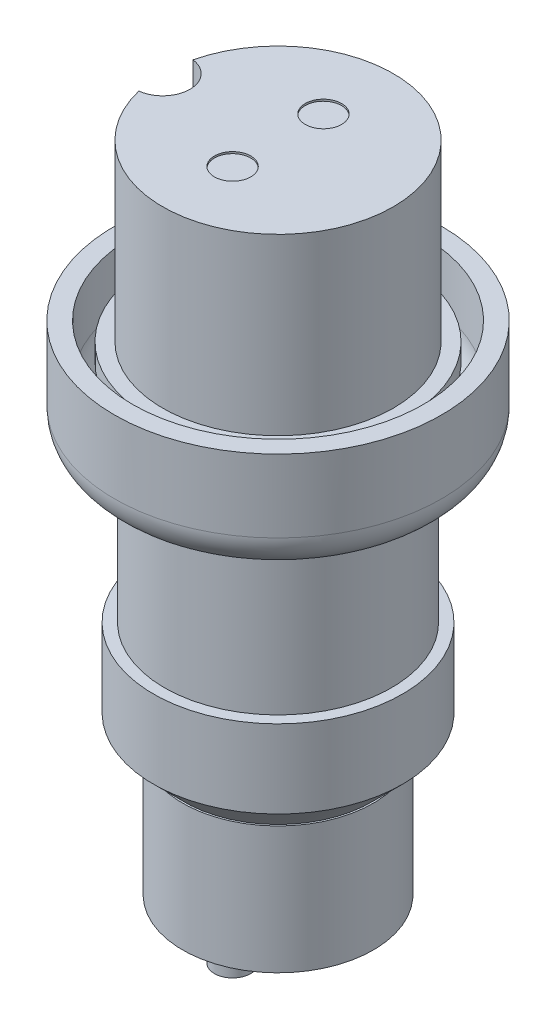
ISO-10303-21;
HEADER;
FILE_DESCRIPTION(('STEP AP214'),'2;1');
FILE_NAME('part.step','',(''),(''),'','','');
FILE_SCHEMA(('AUTOMOTIVE_DESIGN { 1 0 10303 214 1 1 1 1 }'));
ENDSEC;
DATA;
#1=APPLICATION_CONTEXT('core data for automotive mechanical design processes');
#2=APPLICATION_PROTOCOL_DEFINITION('international standard','automotive_design',2000,#1);
#3=PRODUCT_CONTEXT('',#1,'mechanical');
#4=PRODUCT('Part','Part','',(#3));
#5=PRODUCT_RELATED_PRODUCT_CATEGORY('part','',(#4));
#6=PRODUCT_DEFINITION_FORMATION('','',#4);
#7=PRODUCT_DEFINITION_CONTEXT('part definition',#1,'design');
#8=PRODUCT_DEFINITION('design','',#6,#7);
#9=PRODUCT_DEFINITION_SHAPE('','',#8);
#10=(LENGTH_UNIT() NAMED_UNIT(*) SI_UNIT(.MILLI.,.METRE.));
#11=(NAMED_UNIT(*) PLANE_ANGLE_UNIT() SI_UNIT($,.RADIAN.));
#12=(NAMED_UNIT(*) SI_UNIT($,.STERADIAN.) SOLID_ANGLE_UNIT());
#13=UNCERTAINTY_MEASURE_WITH_UNIT(LENGTH_MEASURE(1.E-05),#10,'distance_accuracy_value','');
#14=(GEOMETRIC_REPRESENTATION_CONTEXT(3) GLOBAL_UNCERTAINTY_ASSIGNED_CONTEXT((#13)) GLOBAL_UNIT_ASSIGNED_CONTEXT((#10,
#11,#12)) REPRESENTATION_CONTEXT('',''));
#15=CARTESIAN_POINT('',(0.,0.,0.));
#16=DIRECTION('',(0.,0.,1.));
#17=DIRECTION('',(1.,0.,0.));
#18=AXIS2_PLACEMENT_3D('',#15,#16,#17);
#19=CARTESIAN_POINT('',(0.,-13.38,0.));
#20=DIRECTION('',(0.,1.,0.));
#21=DIRECTION('',(0.,0.,1.));
#22=AXIS2_PLACEMENT_3D('',#19,#20,#21);
#23=CYLINDRICAL_SURFACE('',#22,6.25);
#24=CARTESIAN_POINT('',(0.,-5.,0.));
#25=DIRECTION('',(0.,-1.,0.));
#26=DIRECTION('',(0.,0.,-1.));
#27=AXIS2_PLACEMENT_3D('',#24,#25,#26);
#28=CIRCLE('',#27,6.25);
#29=CARTESIAN_POINT('',(0.,-5.,-6.25));
#30=VERTEX_POINT('',#29);
#31=EDGE_CURVE('E92',#30,#30,#28,.T.);
#32=ORIENTED_EDGE('',*,*,#31,.T.);
#33=EDGE_LOOP('',(#32));
#34=FACE_BOUND('',#33,.T.);
#35=CARTESIAN_POINT('',(0.,-13.38,0.));
#36=DIRECTION('',(0.,-1.,0.));
#37=DIRECTION('',(0.,0.,-1.));
#38=AXIS2_PLACEMENT_3D('',#35,#36,#37);
#39=CIRCLE('',#38,6.25);
#40=CARTESIAN_POINT('',(0.,-13.38,-6.25));
#41=VERTEX_POINT('',#40);
#42=EDGE_CURVE('E147',#41,#41,#39,.T.);
#43=ORIENTED_EDGE('',*,*,#42,.F.);
#44=EDGE_LOOP('',(#43));
#45=FACE_BOUND('',#44,.T.);
#46=ADVANCED_FACE('F36',(#34,#45),#23,.T.);
#47=CARTESIAN_POINT('',(0.,-19.38,0.));
#48=DIRECTION('',(0.,1.,0.));
#49=DIRECTION('',(0.,0.,1.));
#50=AXIS2_PLACEMENT_3D('',#47,#48,#49);
#51=CYLINDRICAL_SURFACE('',#50,6.85);
#52=CARTESIAN_POINT('',(0.,-17.68,0.));
#53=DIRECTION('',(0.,-1.,0.));
#54=DIRECTION('',(0.,0.,-1.));
#55=AXIS2_PLACEMENT_3D('',#52,#53,#54);
#56=CIRCLE('',#55,6.85);
#57=CARTESIAN_POINT('',(0.,-17.68,-6.85));
#58=VERTEX_POINT('',#57);
#59=EDGE_CURVE('E88',#58,#58,#56,.F.);
#60=ORIENTED_EDGE('',*,*,#59,.T.);
#61=EDGE_LOOP('',(#60));
#62=FACE_BOUND('',#61,.T.);
#63=CARTESIAN_POINT('',(0.,-13.38,0.));
#64=DIRECTION('',(0.,-1.,0.));
#65=DIRECTION('',(0.,0.,-1.));
#66=AXIS2_PLACEMENT_3D('',#63,#64,#65);
#67=CIRCLE('',#66,6.85);
#68=CARTESIAN_POINT('',(0.,-13.38,-6.85));
#69=VERTEX_POINT('',#68);
#70=EDGE_CURVE('E148',#69,#69,#67,.T.);
#71=ORIENTED_EDGE('',*,*,#70,.T.);
#72=EDGE_LOOP('',(#71));
#73=FACE_BOUND('',#72,.T.);
#74=ADVANCED_FACE('F122',(#62,#73),#51,.T.);
#75=CARTESIAN_POINT('',(0.,-13.38,0.));
#76=DIRECTION('',(0.,-1.,0.));
#77=DIRECTION('',(0.,0.,-1.));
#78=AXIS2_PLACEMENT_3D('',#75,#76,#77);
#79=PLANE('',#78);
#80=ORIENTED_EDGE('',*,*,#42,.T.);
#81=EDGE_LOOP('',(#80));
#82=FACE_BOUND('',#81,.T.);
#83=ORIENTED_EDGE('',*,*,#70,.F.);
#84=EDGE_LOOP('',(#83));
#85=FACE_BOUND('',#84,.T.);
#86=ADVANCED_FACE('F128',(#82,#85),#79,.F.);
#87=CARTESIAN_POINT('',(0.,-19.38,0.));
#88=DIRECTION('',(0.,1.,0.));
#89=DIRECTION('',(0.,0.,1.));
#90=AXIS2_PLACEMENT_3D('',#87,#88,#89);
#91=CONICAL_SURFACE('',#90,5.14999999999999,0.785398163397446);
#92=ORIENTED_EDGE('',*,*,#59,.F.);
#93=EDGE_LOOP('',(#92));
#94=FACE_BOUND('',#93,.T.);
#95=CARTESIAN_POINT('',(0.,-19.38,0.));
#96=DIRECTION('',(0.,-1.,0.));
#97=DIRECTION('',(0.,0.,-1.));
#98=AXIS2_PLACEMENT_3D('',#95,#96,#97);
#99=CIRCLE('',#98,5.14999999999999);
#100=CARTESIAN_POINT('',(0.,-19.38,-5.14999999999999));
#101=VERTEX_POINT('',#100);
#102=EDGE_CURVE('E79',#101,#101,#99,.T.);
#103=ORIENTED_EDGE('',*,*,#102,.F.);
#104=EDGE_LOOP('',(#103));
#105=FACE_BOUND('',#104,.T.);
#106=ADVANCED_FACE('F256',(#94,#105),#91,.T.);
#107=CARTESIAN_POINT('',(0.,-26.38,0.));
#108=DIRECTION('',(0.,1.,0.));
#109=DIRECTION('',(0.,0.,1.));
#110=AXIS2_PLACEMENT_3D('',#107,#108,#109);
#111=CYLINDRICAL_SURFACE('',#110,5.25);
#112=CARTESIAN_POINT('',(0.,-26.38,0.));
#113=DIRECTION('',(0.,-1.,0.));
#114=DIRECTION('',(0.,0.,-1.));
#115=AXIS2_PLACEMENT_3D('',#112,#113,#114);
#116=CIRCLE('',#115,5.25);
#117=CARTESIAN_POINT('',(0.,-26.38,-5.25));
#118=VERTEX_POINT('',#117);
#119=EDGE_CURVE('E153',#118,#118,#116,.T.);
#120=ORIENTED_EDGE('',*,*,#119,.F.);
#121=EDGE_LOOP('',(#120));
#122=FACE_BOUND('',#121,.T.);
#123=CARTESIAN_POINT('',(0.,-19.38,0.));
#124=DIRECTION('',(0.,-1.,0.));
#125=DIRECTION('',(0.,0.,-1.));
#126=AXIS2_PLACEMENT_3D('',#123,#124,#125);
#127=CIRCLE('',#126,5.25);
#128=CARTESIAN_POINT('',(0.,-19.38,-5.25));
#129=VERTEX_POINT('',#128);
#130=EDGE_CURVE('E95',#129,#129,#127,.T.);
#131=ORIENTED_EDGE('',*,*,#130,.T.);
#132=EDGE_LOOP('',(#131));
#133=FACE_BOUND('',#132,.T.);
#134=ADVANCED_FACE('F249',(#122,#133),#111,.T.);
#135=CARTESIAN_POINT('',(0.,-26.38,0.));
#136=DIRECTION('',(0.,-1.,0.));
#137=DIRECTION('',(0.,0.,-1.));
#138=AXIS2_PLACEMENT_3D('',#135,#136,#137);
#139=PLANE('',#138);
#140=CARTESIAN_POINT('',(0.,-26.38,2.5));
#141=DIRECTION('',(0.,-1.,0.));
#142=DIRECTION('',(0.,0.,-1.));
#143=AXIS2_PLACEMENT_3D('',#140,#141,#142);
#144=CIRCLE('',#143,1.);
#145=CARTESIAN_POINT('',(0.,-26.38,1.5));
#146=VERTEX_POINT('',#145);
#147=EDGE_CURVE('E67',#146,#146,#144,.T.);
#148=ORIENTED_EDGE('',*,*,#147,.F.);
#149=EDGE_LOOP('',(#148));
#150=FACE_BOUND('',#149,.T.);
#151=CARTESIAN_POINT('',(0.,-26.38,-2.5));
#152=DIRECTION('',(0.,-1.,0.));
#153=DIRECTION('',(0.,0.,-1.));
#154=AXIS2_PLACEMENT_3D('',#151,#152,#153);
#155=CIRCLE('',#154,1.);
#156=CARTESIAN_POINT('',(0.,-26.38,-3.5));
#157=VERTEX_POINT('',#156);
#158=EDGE_CURVE('E166',#157,#157,#155,.T.);
#159=ORIENTED_EDGE('',*,*,#158,.F.);
#160=EDGE_LOOP('',(#159));
#161=FACE_BOUND('',#160,.T.);
#162=ORIENTED_EDGE('',*,*,#119,.T.);
#163=EDGE_LOOP('',(#162));
#164=FACE_BOUND('',#163,.T.);
#165=ADVANCED_FACE('F246',(#150,#161,#164),#139,.T.);
#166=CARTESIAN_POINT('',(0.,-19.38,0.));
#167=DIRECTION('',(0.,-1.,0.));
#168=DIRECTION('',(0.,0.,-1.));
#169=AXIS2_PLACEMENT_3D('',#166,#167,#168);
#170=PLANE('',#169);
#171=ORIENTED_EDGE('',*,*,#102,.T.);
#172=EDGE_LOOP('',(#171));
#173=FACE_BOUND('',#172,.T.);
#174=ORIENTED_EDGE('',*,*,#130,.F.);
#175=EDGE_LOOP('',(#174));
#176=FACE_BOUND('',#175,.T.);
#177=ADVANCED_FACE('F244',(#173,#176),#170,.F.);
#178=CARTESIAN_POINT('',(0.,-4.,0.));
#179=DIRECTION('',(0.,-1.,0.));
#180=DIRECTION('',(0.,0.,-1.));
#181=AXIS2_PLACEMENT_3D('',#178,#179,#180);
#182=CYLINDRICAL_SURFACE('',#181,9.);
#183=CARTESIAN_POINT('',(0.,-3.,0.));
#184=DIRECTION('',(0.,-1.,0.));
#185=DIRECTION('',(0.,0.,-1.));
#186=AXIS2_PLACEMENT_3D('',#183,#184,#185);
#187=CIRCLE('',#186,9.);
#188=CARTESIAN_POINT('',(0.,-3.,-9.));
#189=VERTEX_POINT('',#188);
#190=EDGE_CURVE('E11',#189,#189,#187,.F.);
#191=ORIENTED_EDGE('',*,*,#190,.T.);
#192=EDGE_LOOP('',(#191));
#193=FACE_BOUND('',#192,.T.);
#194=CARTESIAN_POINT('',(0.,1.,0.));
#195=DIRECTION('',(0.,1.,0.));
#196=DIRECTION('',(0.,0.,1.));
#197=AXIS2_PLACEMENT_3D('',#194,#195,#196);
#198=CIRCLE('',#197,9.);
#199=CARTESIAN_POINT('',(0.,1.,9.));
#200=VERTEX_POINT('',#199);
#201=EDGE_CURVE('E96',#200,#200,#198,.T.);
#202=ORIENTED_EDGE('',*,*,#201,.F.);
#203=EDGE_LOOP('',(#202));
#204=FACE_BOUND('',#203,.T.);
#205=ADVANCED_FACE('F241',(#193,#204),#182,.T.);
#206=CARTESIAN_POINT('',(0.,-5.,0.));
#207=DIRECTION('',(0.,-1.,0.));
#208=DIRECTION('',(0.,0.,-1.));
#209=AXIS2_PLACEMENT_3D('',#206,#207,#208);
#210=PLANE('',#209);
#211=CARTESIAN_POINT('',(0.,-5.,0.));
#212=DIRECTION('',(0.,-1.,0.));
#213=DIRECTION('',(0.,0.,-1.));
#214=AXIS2_PLACEMENT_3D('',#211,#212,#213);
#215=CIRCLE('',#214,7.);
#216=CARTESIAN_POINT('',(0.,-5.,-7.));
#217=VERTEX_POINT('',#216);
#218=EDGE_CURVE('E44',#217,#217,#215,.T.);
#219=ORIENTED_EDGE('',*,*,#218,.T.);
#220=EDGE_LOOP('',(#219));
#221=FACE_BOUND('',#220,.T.);
#222=ORIENTED_EDGE('',*,*,#31,.F.);
#223=EDGE_LOOP('',(#222));
#224=FACE_BOUND('',#223,.T.);
#225=ADVANCED_FACE('F104',(#221,#224),#210,.T.);
#226=CARTESIAN_POINT('',(0.,1.,0.));
#227=DIRECTION('',(0.,1.,0.));
#228=DIRECTION('',(0.,0.,1.));
#229=AXIS2_PLACEMENT_3D('',#226,#227,#228);
#230=PLANE('',#229);
#231=ORIENTED_EDGE('',*,*,#201,.T.);
#232=EDGE_LOOP('',(#231));
#233=FACE_BOUND('',#232,.T.);
#234=CARTESIAN_POINT('',(0.,1.,0.));
#235=DIRECTION('',(0.,1.,0.));
#236=DIRECTION('',(0.,0.,1.));
#237=AXIS2_PLACEMENT_3D('',#234,#235,#236);
#238=CIRCLE('',#237,8.);
#239=CARTESIAN_POINT('',(0.,1.,8.));
#240=VERTEX_POINT('',#239);
#241=EDGE_CURVE('E162',#240,#240,#238,.T.);
#242=ORIENTED_EDGE('',*,*,#241,.F.);
#243=EDGE_LOOP('',(#242));
#244=FACE_BOUND('',#243,.T.);
#245=ADVANCED_FACE('F234',(#233,#244),#230,.T.);
#246=CARTESIAN_POINT('',(0.,1.,0.));
#247=DIRECTION('',(0.,-1.,0.));
#248=DIRECTION('',(0.,0.,-1.));
#249=AXIS2_PLACEMENT_3D('',#246,#247,#248);
#250=CYLINDRICAL_SURFACE('',#249,8.);
#251=CARTESIAN_POINT('',(0.,-2.01568651670156,0.));
#252=DIRECTION('',(0.,-1.,0.));
#253=DIRECTION('',(0.,0.,-1.));
#254=AXIS2_PLACEMENT_3D('',#251,#252,#253);
#255=CIRCLE('',#254,8.);
#256=CARTESIAN_POINT('',(0.,-2.01568651670156,-8.));
#257=VERTEX_POINT('',#256);
#258=EDGE_CURVE('E99',#257,#257,#255,.T.);
#259=ORIENTED_EDGE('',*,*,#258,.T.);
#260=EDGE_LOOP('',(#259));
#261=FACE_BOUND('',#260,.T.);
#262=ORIENTED_EDGE('',*,*,#241,.T.);
#263=EDGE_LOOP('',(#262));
#264=FACE_BOUND('',#263,.T.);
#265=ADVANCED_FACE('F203',(#261,#264),#250,.F.);
#266=CARTESIAN_POINT('',(0.,9.6,0.));
#267=DIRECTION('',(0.,1.,0.));
#268=DIRECTION('',(0.,0.,1.));
#269=AXIS2_PLACEMENT_3D('',#266,#267,#268);
#270=PLANE('',#269);
#271=CARTESIAN_POINT('',(0.,9.6,-2.5));
#272=DIRECTION('',(0.,1.,0.));
#273=DIRECTION('',(0.,0.,1.));
#274=AXIS2_PLACEMENT_3D('',#271,#272,#273);
#275=CIRCLE('',#274,1.);
#276=CARTESIAN_POINT('',(0.,9.6,-1.5));
#277=VERTEX_POINT('',#276);
#278=EDGE_CURVE('E185',#277,#277,#275,.T.);
#279=ORIENTED_EDGE('',*,*,#278,.F.);
#280=EDGE_LOOP('',(#279));
#281=FACE_BOUND('',#280,.T.);
#282=CARTESIAN_POINT('',(0.,9.6,2.5));
#283=DIRECTION('',(0.,1.,0.));
#284=DIRECTION('',(0.,0.,1.));
#285=AXIS2_PLACEMENT_3D('',#282,#283,#284);
#286=CIRCLE('',#285,1.);
#287=CARTESIAN_POINT('',(0.,9.6,3.5));
#288=VERTEX_POINT('',#287);
#289=EDGE_CURVE('E179',#288,#288,#286,.T.);
#290=ORIENTED_EDGE('',*,*,#289,.F.);
#291=EDGE_LOOP('',(#290));
#292=FACE_BOUND('',#291,.T.);
#293=CARTESIAN_POINT('',(-6.35,9.6,0.));
#294=DIRECTION('',(0.,1.,0.));
#295=DIRECTION('',(0.,0.,1.));
#296=AXIS2_PLACEMENT_3D('',#293,#294,#295);
#297=CIRCLE('',#296,1.5);
#298=CARTESIAN_POINT('',(-6.17283464566929,9.6,1.48950073421428));
#299=VERTEX_POINT('',#298);
#300=CARTESIAN_POINT('',(-6.17283464566929,9.6,-1.48950073421428));
#301=VERTEX_POINT('',#300);
#302=EDGE_CURVE('E56',#299,#301,#297,.T.);
#303=ORIENTED_EDGE('',*,*,#302,.F.);
#304=CARTESIAN_POINT('',(0.,9.6,0.));
#305=DIRECTION('',(0.,1.,0.));
#306=DIRECTION('',(0.,0.,1.));
#307=AXIS2_PLACEMENT_3D('',#304,#305,#306);
#308=CIRCLE('',#307,6.35);
#309=EDGE_CURVE('E76',#299,#301,#308,.T.);
#310=ORIENTED_EDGE('',*,*,#309,.T.);
#311=EDGE_LOOP('',(#303,#310));
#312=FACE_BOUND('',#311,.T.);
#313=ADVANCED_FACE('F200',(#281,#292,#312),#270,.T.);
#314=CARTESIAN_POINT('',(0.,9.6,0.));
#315=DIRECTION('',(0.,-1.,0.));
#316=DIRECTION('',(0.,0.,-1.));
#317=AXIS2_PLACEMENT_3D('',#314,#315,#316);
#318=CYLINDRICAL_SURFACE('',#317,6.35);
#319=CARTESIAN_POINT('',(0.,0.,0.));
#320=DIRECTION('',(0.,-1.,0.));
#321=DIRECTION('',(0.,0.,-1.));
#322=AXIS2_PLACEMENT_3D('',#319,#320,#321);
#323=CIRCLE('',#322,6.35);
#324=CARTESIAN_POINT('',(-6.17283464566929,0.,-1.48950073421428));
#325=VERTEX_POINT('',#324);
#326=CARTESIAN_POINT('',(-6.17283464566929,0.,1.48950073421428));
#327=VERTEX_POINT('',#326);
#328=EDGE_CURVE('E73',#325,#327,#323,.T.);
#329=ORIENTED_EDGE('',*,*,#328,.F.);
#330=DIRECTION('',(0.,1.,0.));
#331=VECTOR('',#330,1.);
#332=CARTESIAN_POINT('',(-6.17283464566929,4.8,-1.48950073421428));
#333=LINE('',#332,#331);
#334=EDGE_CURVE('E61',#325,#301,#333,.T.);
#335=ORIENTED_EDGE('',*,*,#334,.T.);
#336=ORIENTED_EDGE('',*,*,#309,.F.);
#337=DIRECTION('',(0.,1.,0.));
#338=VECTOR('',#337,1.);
#339=CARTESIAN_POINT('',(-6.17283464566929,4.8,1.48950073421428));
#340=LINE('',#339,#338);
#341=EDGE_CURVE('E68',#299,#327,#340,.F.);
#342=ORIENTED_EDGE('',*,*,#341,.T.);
#343=EDGE_LOOP('',(#329,#335,#336,#342));
#344=FACE_BOUND('',#343,.T.);
#345=ADVANCED_FACE('F75',(#344),#318,.T.);
#346=CARTESIAN_POINT('',(0.,0.,0.));
#347=DIRECTION('',(0.,-1.,0.));
#348=DIRECTION('',(0.,0.,-1.));
#349=AXIS2_PLACEMENT_3D('',#346,#347,#348);
#350=PLANE('',#349);
#351=CARTESIAN_POINT('',(0.,0.,0.));
#352=DIRECTION('',(0.,-1.,0.));
#353=DIRECTION('',(0.,0.,-1.));
#354=AXIS2_PLACEMENT_3D('',#351,#352,#353);
#355=CIRCLE('',#354,7.125);
#356=CARTESIAN_POINT('',(0.,0.,-7.125));
#357=VERTEX_POINT('',#356);
#358=EDGE_CURVE('E82',#357,#357,#355,.T.);
#359=ORIENTED_EDGE('',*,*,#358,.F.);
#360=EDGE_LOOP('',(#359));
#361=FACE_BOUND('',#360,.T.);
#362=ORIENTED_EDGE('',*,*,#328,.T.);
#363=CARTESIAN_POINT('',(-6.35,0.,0.));
#364=DIRECTION('',(0.,-1.,0.));
#365=DIRECTION('',(0.,0.,-1.));
#366=AXIS2_PLACEMENT_3D('',#363,#364,#365);
#367=CIRCLE('',#366,1.5);
#368=EDGE_CURVE('E51',#327,#325,#367,.F.);
#369=ORIENTED_EDGE('',*,*,#368,.T.);
#370=EDGE_LOOP('',(#362,#369));
#371=FACE_BOUND('',#370,.T.);
#372=ADVANCED_FACE('F72',(#361,#371),#350,.F.);
#373=CARTESIAN_POINT('',(0.,-1.,0.));
#374=DIRECTION('',(0.,1.,0.));
#375=DIRECTION('',(0.,0.,1.));
#376=AXIS2_PLACEMENT_3D('',#373,#374,#375);
#377=CYLINDRICAL_SURFACE('',#376,7.125);
#378=CARTESIAN_POINT('',(0.,-1.,0.));
#379=DIRECTION('',(0.,-1.,0.));
#380=DIRECTION('',(0.,0.,-1.));
#381=AXIS2_PLACEMENT_3D('',#378,#379,#380);
#382=CIRCLE('',#381,7.125);
#383=CARTESIAN_POINT('',(0.,-1.,-7.125));
#384=VERTEX_POINT('',#383);
#385=EDGE_CURVE('E77',#384,#384,#382,.T.);
#386=ORIENTED_EDGE('',*,*,#385,.F.);
#387=EDGE_LOOP('',(#386));
#388=FACE_BOUND('',#387,.T.);
#389=ORIENTED_EDGE('',*,*,#358,.T.);
#390=EDGE_LOOP('',(#389));
#391=FACE_BOUND('',#390,.T.);
#392=ADVANCED_FACE('F139',(#388,#391),#377,.T.);
#393=CARTESIAN_POINT('',(0.,-1.,0.));
#394=DIRECTION('',(0.,-1.,0.));
#395=DIRECTION('',(0.,0.,-1.));
#396=AXIS2_PLACEMENT_3D('',#393,#394,#395);
#397=PLANE('',#396);
#398=CARTESIAN_POINT('',(0.,-1.,0.));
#399=DIRECTION('',(0.,-1.,0.));
#400=DIRECTION('',(0.,0.,-1.));
#401=AXIS2_PLACEMENT_3D('',#398,#399,#400);
#402=CIRCLE('',#401,6.25);
#403=CARTESIAN_POINT('',(0.,-1.,-6.25));
#404=VERTEX_POINT('',#403);
#405=EDGE_CURVE('E144',#404,#404,#402,.T.);
#406=ORIENTED_EDGE('',*,*,#405,.F.);
#407=EDGE_LOOP('',(#406));
#408=FACE_BOUND('',#407,.T.);
#409=ORIENTED_EDGE('',*,*,#385,.T.);
#410=EDGE_LOOP('',(#409));
#411=FACE_BOUND('',#410,.T.);
#412=ADVANCED_FACE('F134',(#408,#411),#397,.T.);
#413=ORIENTED_EDGE('',*,*,#405,.T.);
#414=EDGE_LOOP('',(#413));
#415=FACE_BOUND('',#414,.T.);
#416=CARTESIAN_POINT('',(0.,-4.,0.));
#417=DIRECTION('',(0.,-1.,0.));
#418=DIRECTION('',(0.,0.,-1.));
#419=AXIS2_PLACEMENT_3D('',#416,#417,#418);
#420=CIRCLE('',#419,6.25);
#421=CARTESIAN_POINT('',(0.,-4.,-6.25));
#422=VERTEX_POINT('',#421);
#423=EDGE_CURVE('E91',#422,#422,#420,.T.);
#424=ORIENTED_EDGE('',*,*,#423,.F.);
#425=EDGE_LOOP('',(#424));
#426=FACE_BOUND('',#425,.T.);
#427=ADVANCED_FACE('F118',(#415,#426),#23,.T.);
#428=CARTESIAN_POINT('',(0.,-2.01568651670156,0.));
#429=DIRECTION('',(0.,-1.,0.));
#430=DIRECTION('',(0.,0.,-1.));
#431=AXIS2_PLACEMENT_3D('',#428,#429,#430);
#432=TOROIDAL_SURFACE('',#431,6.,2.);
#433=ORIENTED_EDGE('',*,*,#258,.F.);
#434=EDGE_LOOP('',(#433));
#435=FACE_BOUND('',#434,.T.);
#436=ORIENTED_EDGE('',*,*,#423,.T.);
#437=EDGE_LOOP('',(#436));
#438=FACE_BOUND('',#437,.T.);
#439=ADVANCED_FACE('F109',(#435,#438),#432,.F.);
#440=CARTESIAN_POINT('',(0.,-3.,0.));
#441=DIRECTION('',(0.,-1.,0.));
#442=DIRECTION('',(0.,0.,-1.));
#443=AXIS2_PLACEMENT_3D('',#440,#441,#442);
#444=TOROIDAL_SURFACE('',#443,7.,2.);
#445=ORIENTED_EDGE('',*,*,#190,.F.);
#446=EDGE_LOOP('',(#445));
#447=FACE_BOUND('',#446,.T.);
#448=ORIENTED_EDGE('',*,*,#218,.F.);
#449=EDGE_LOOP('',(#448));
#450=FACE_BOUND('',#449,.T.);
#451=ADVANCED_FACE('F38',(#447,#450),#444,.T.);
#452=CARTESIAN_POINT('',(0.,-28.38,-2.5));
#453=DIRECTION('',(0.,1.,0.));
#454=DIRECTION('',(0.,0.,1.));
#455=AXIS2_PLACEMENT_3D('',#452,#453,#454);
#456=CYLINDRICAL_SURFACE('',#455,1.);
#457=CARTESIAN_POINT('',(0.,-28.38,-2.5));
#458=DIRECTION('',(0.,-1.,0.));
#459=DIRECTION('',(0.,0.,-1.));
#460=AXIS2_PLACEMENT_3D('',#457,#458,#459);
#461=CIRCLE('',#460,1.);
#462=CARTESIAN_POINT('',(0.,-28.38,-3.5));
#463=VERTEX_POINT('',#462);
#464=EDGE_CURVE('E165',#463,#463,#461,.T.);
#465=ORIENTED_EDGE('',*,*,#464,.F.);
#466=EDGE_LOOP('',(#465));
#467=FACE_BOUND('',#466,.T.);
#468=ORIENTED_EDGE('',*,*,#158,.T.);
#469=EDGE_LOOP('',(#468));
#470=FACE_BOUND('',#469,.T.);
#471=ADVANCED_FACE('F108',(#467,#470),#456,.T.);
#472=CARTESIAN_POINT('',(0.,-28.38,-2.5));
#473=DIRECTION('',(0.,-1.,0.));
#474=DIRECTION('',(0.,0.,-1.));
#475=AXIS2_PLACEMENT_3D('',#472,#473,#474);
#476=PLANE('',#475);
#477=ORIENTED_EDGE('',*,*,#464,.T.);
#478=EDGE_LOOP('',(#477));
#479=FACE_BOUND('',#478,.T.);
#480=ADVANCED_FACE('F115',(#479),#476,.T.);
#481=CARTESIAN_POINT('',(0.,-28.38,2.5));
#482=DIRECTION('',(0.,1.,0.));
#483=DIRECTION('',(0.,0.,1.));
#484=AXIS2_PLACEMENT_3D('',#481,#482,#483);
#485=CYLINDRICAL_SURFACE('',#484,1.);
#486=CARTESIAN_POINT('',(0.,-28.38,2.5));
#487=DIRECTION('',(0.,-1.,0.));
#488=DIRECTION('',(0.,0.,-1.));
#489=AXIS2_PLACEMENT_3D('',#486,#487,#488);
#490=CIRCLE('',#489,1.);
#491=CARTESIAN_POINT('',(0.,-28.38,1.5));
#492=VERTEX_POINT('',#491);
#493=EDGE_CURVE('E169',#492,#492,#490,.T.);
#494=ORIENTED_EDGE('',*,*,#493,.F.);
#495=EDGE_LOOP('',(#494));
#496=FACE_BOUND('',#495,.T.);
#497=ORIENTED_EDGE('',*,*,#147,.T.);
#498=EDGE_LOOP('',(#497));
#499=FACE_BOUND('',#498,.T.);
#500=ADVANCED_FACE('F224',(#496,#499),#485,.T.);
#501=CARTESIAN_POINT('',(0.,-28.38,2.5));
#502=DIRECTION('',(0.,-1.,0.));
#503=DIRECTION('',(0.,0.,-1.));
#504=AXIS2_PLACEMENT_3D('',#501,#502,#503);
#505=PLANE('',#504);
#506=ORIENTED_EDGE('',*,*,#493,.T.);
#507=EDGE_LOOP('',(#506));
#508=FACE_BOUND('',#507,.T.);
#509=ADVANCED_FACE('F218',(#508),#505,.T.);
#510=CARTESIAN_POINT('',(-6.35,-4.24264068711929,0.));
#511=DIRECTION('',(0.,1.,0.));
#512=DIRECTION('',(0.,0.,1.));
#513=AXIS2_PLACEMENT_3D('',#510,#511,#512);
#514=CYLINDRICAL_SURFACE('',#513,1.5);
#515=ORIENTED_EDGE('',*,*,#368,.F.);
#516=ORIENTED_EDGE('',*,*,#341,.F.);
#517=ORIENTED_EDGE('',*,*,#302,.T.);
#518=ORIENTED_EDGE('',*,*,#334,.F.);
#519=EDGE_LOOP('',(#515,#516,#517,#518));
#520=FACE_BOUND('',#519,.T.);
#521=ADVANCED_FACE('F62',(#520),#514,.F.);
#522=CARTESIAN_POINT('',(0.,9.5,2.5));
#523=DIRECTION('',(0.,1.,0.));
#524=DIRECTION('',(0.,0.,1.));
#525=AXIS2_PLACEMENT_3D('',#522,#523,#524);
#526=CYLINDRICAL_SURFACE('',#525,1.);
#527=CARTESIAN_POINT('',(0.,9.5,2.5));
#528=DIRECTION('',(0.,1.,0.));
#529=DIRECTION('',(0.,0.,1.));
#530=AXIS2_PLACEMENT_3D('',#527,#528,#529);
#531=CIRCLE('',#530,1.);
#532=CARTESIAN_POINT('',(0.,9.5,3.5));
#533=VERTEX_POINT('',#532);
#534=EDGE_CURVE('E178',#533,#533,#531,.T.);
#535=ORIENTED_EDGE('',*,*,#534,.F.);
#536=EDGE_LOOP('',(#535));
#537=FACE_BOUND('',#536,.T.);
#538=ORIENTED_EDGE('',*,*,#289,.T.);
#539=EDGE_LOOP('',(#538));
#540=FACE_BOUND('',#539,.T.);
#541=ADVANCED_FACE('F208',(#537,#540),#526,.F.);
#542=CARTESIAN_POINT('',(0.,9.5,2.5));
#543=DIRECTION('',(0.,1.,0.));
#544=DIRECTION('',(0.,0.,1.));
#545=AXIS2_PLACEMENT_3D('',#542,#543,#544);
#546=PLANE('',#545);
#547=ORIENTED_EDGE('',*,*,#534,.T.);
#548=EDGE_LOOP('',(#547));
#549=FACE_BOUND('',#548,.T.);
#550=ADVANCED_FACE('F196',(#549),#546,.T.);
#551=CARTESIAN_POINT('',(0.,9.5,-2.5));
#552=DIRECTION('',(0.,1.,0.));
#553=DIRECTION('',(0.,0.,1.));
#554=AXIS2_PLACEMENT_3D('',#551,#552,#553);
#555=CYLINDRICAL_SURFACE('',#554,1.);
#556=CARTESIAN_POINT('',(0.,9.5,-2.5));
#557=DIRECTION('',(0.,1.,0.));
#558=DIRECTION('',(0.,0.,1.));
#559=AXIS2_PLACEMENT_3D('',#556,#557,#558);
#560=CIRCLE('',#559,1.);
#561=CARTESIAN_POINT('',(0.,9.5,-1.5));
#562=VERTEX_POINT('',#561);
#563=EDGE_CURVE('E182',#562,#562,#560,.T.);
#564=ORIENTED_EDGE('',*,*,#563,.F.);
#565=EDGE_LOOP('',(#564));
#566=FACE_BOUND('',#565,.T.);
#567=ORIENTED_EDGE('',*,*,#278,.T.);
#568=EDGE_LOOP('',(#567));
#569=FACE_BOUND('',#568,.T.);
#570=ADVANCED_FACE('F193',(#566,#569),#555,.F.);
#571=CARTESIAN_POINT('',(0.,9.5,-2.5));
#572=DIRECTION('',(0.,1.,0.));
#573=DIRECTION('',(0.,0.,1.));
#574=AXIS2_PLACEMENT_3D('',#571,#572,#573);
#575=PLANE('',#574);
#576=ORIENTED_EDGE('',*,*,#563,.T.);
#577=EDGE_LOOP('',(#576));
#578=FACE_BOUND('',#577,.T.);
#579=ADVANCED_FACE('F191',(#578),#575,.T.);
#580=CLOSED_SHELL('',(#46,#74,#86,#106,#134,#165,#177,#205,#225,#245,#265,#313,#345,#372,#392,
#412,#427,#439,#451,#471,#480,#500,#509,#521,#541,#550,#570,#579));
#581=MANIFOLD_SOLID_BREP('B2',#580);
#582=ADVANCED_BREP_SHAPE_REPRESENTATION('',(#18,#581),#14);
#583=SHAPE_DEFINITION_REPRESENTATION(#9,#582);
ENDSEC;
END-ISO-10303-21;
